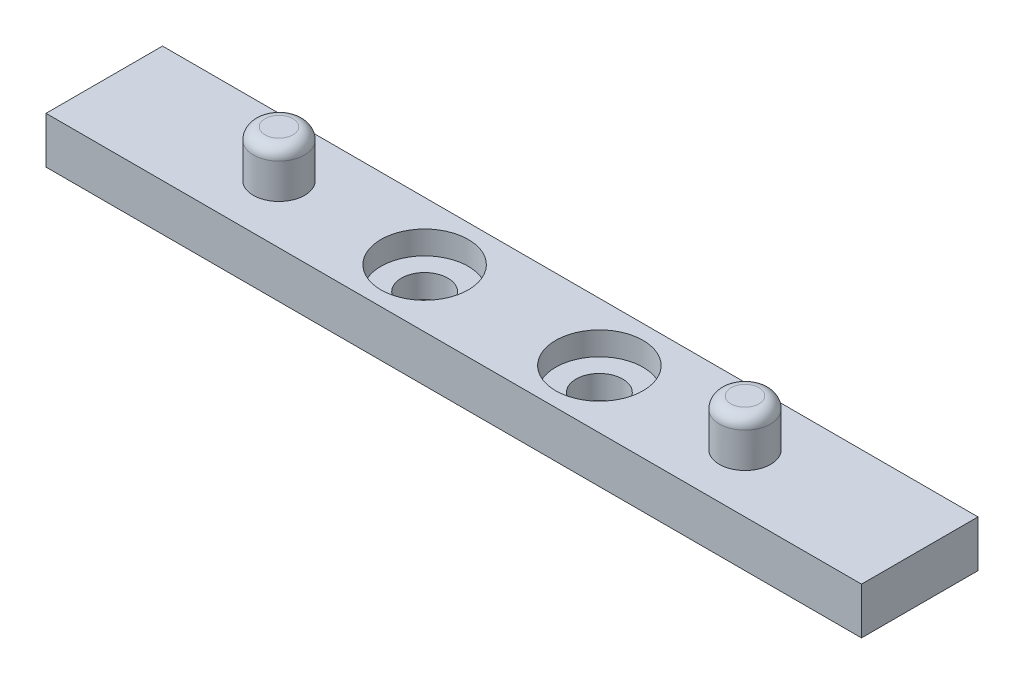
ISO-10303-21;
HEADER;
FILE_DESCRIPTION(('STEP AP214'),'2;1');
FILE_NAME('part.step','',(''),(''),'','','');
FILE_SCHEMA(('AUTOMOTIVE_DESIGN { 1 0 10303 214 1 1 1 1 }'));
ENDSEC;
DATA;
#1=APPLICATION_CONTEXT('core data for automotive mechanical design processes');
#2=APPLICATION_PROTOCOL_DEFINITION('international standard','automotive_design',2000,#1);
#3=PRODUCT_CONTEXT('',#1,'mechanical');
#4=PRODUCT('Part','Part','',(#3));
#5=PRODUCT_RELATED_PRODUCT_CATEGORY('part','',(#4));
#6=PRODUCT_DEFINITION_FORMATION('','',#4);
#7=PRODUCT_DEFINITION_CONTEXT('part definition',#1,'design');
#8=PRODUCT_DEFINITION('design','',#6,#7);
#9=PRODUCT_DEFINITION_SHAPE('','',#8);
#10=(LENGTH_UNIT() NAMED_UNIT(*) SI_UNIT(.MILLI.,.METRE.));
#11=(NAMED_UNIT(*) PLANE_ANGLE_UNIT() SI_UNIT($,.RADIAN.));
#12=(NAMED_UNIT(*) SI_UNIT($,.STERADIAN.) SOLID_ANGLE_UNIT());
#13=UNCERTAINTY_MEASURE_WITH_UNIT(LENGTH_MEASURE(1.E-05),#10,'distance_accuracy_value','');
#14=(GEOMETRIC_REPRESENTATION_CONTEXT(3) GLOBAL_UNCERTAINTY_ASSIGNED_CONTEXT((#13)) GLOBAL_UNIT_ASSIGNED_CONTEXT((#10,
#11,#12)) REPRESENTATION_CONTEXT('',''));
#15=CARTESIAN_POINT('',(0.,0.,0.));
#16=DIRECTION('',(0.,0.,1.));
#17=DIRECTION('',(1.,0.,0.));
#18=AXIS2_PLACEMENT_3D('',#15,#16,#17);
#19=CARTESIAN_POINT('',(34.925,5.08,-6.35));
#20=DIRECTION('',(0.,-1.,0.));
#21=DIRECTION('',(0.,0.,-1.));
#22=AXIS2_PLACEMENT_3D('',#19,#20,#21);
#23=CYLINDRICAL_SURFACE('',#22,2.54);
#24=CARTESIAN_POINT('',(34.925,0.,-6.35));
#25=DIRECTION('',(0.,1.,0.));
#26=DIRECTION('',(0.,0.,1.));
#27=AXIS2_PLACEMENT_3D('',#24,#25,#26);
#28=CIRCLE('',#27,2.54);
#29=CARTESIAN_POINT('',(34.925,0.,-3.81));
#30=VERTEX_POINT('',#29);
#31=EDGE_CURVE('E110',#30,#30,#28,.T.);
#32=ORIENTED_EDGE('',*,*,#31,.F.);
#33=EDGE_LOOP('',(#32));
#34=FACE_BOUND('',#33,.T.);
#35=CARTESIAN_POINT('',(34.925,2.54,-6.35));
#36=DIRECTION('',(0.,1.,0.));
#37=DIRECTION('',(0.,0.,1.));
#38=AXIS2_PLACEMENT_3D('',#35,#36,#37);
#39=CIRCLE('',#38,2.54);
#40=CARTESIAN_POINT('',(34.925,2.54,-3.81));
#41=VERTEX_POINT('',#40);
#42=EDGE_CURVE('E41',#41,#41,#39,.T.);
#43=ORIENTED_EDGE('',*,*,#42,.T.);
#44=EDGE_LOOP('',(#43));
#45=FACE_BOUND('',#44,.T.);
#46=ADVANCED_FACE('F37',(#34,#45),#23,.F.);
#47=CARTESIAN_POINT('',(53.975,5.08,-6.35));
#48=DIRECTION('',(0.,-1.,0.));
#49=DIRECTION('',(0.,0.,-1.));
#50=AXIS2_PLACEMENT_3D('',#47,#48,#49);
#51=CYLINDRICAL_SURFACE('',#50,2.54);
#52=CARTESIAN_POINT('',(53.975,0.,-6.35));
#53=DIRECTION('',(0.,1.,0.));
#54=DIRECTION('',(0.,0.,1.));
#55=AXIS2_PLACEMENT_3D('',#52,#53,#54);
#56=CIRCLE('',#55,2.54);
#57=CARTESIAN_POINT('',(53.975,0.,-3.81));
#58=VERTEX_POINT('',#57);
#59=EDGE_CURVE('E134',#58,#58,#56,.T.);
#60=ORIENTED_EDGE('',*,*,#59,.F.);
#61=EDGE_LOOP('',(#60));
#62=FACE_BOUND('',#61,.T.);
#63=CARTESIAN_POINT('',(53.975,2.54,-6.35));
#64=DIRECTION('',(0.,1.,0.));
#65=DIRECTION('',(0.,0.,1.));
#66=AXIS2_PLACEMENT_3D('',#63,#64,#65);
#67=CIRCLE('',#66,2.54);
#68=CARTESIAN_POINT('',(53.975,2.54,-3.81));
#69=VERTEX_POINT('',#68);
#70=EDGE_CURVE('E128',#69,#69,#67,.T.);
#71=ORIENTED_EDGE('',*,*,#70,.T.);
#72=EDGE_LOOP('',(#71));
#73=FACE_BOUND('',#72,.T.);
#74=ADVANCED_FACE('F161',(#62,#73),#51,.F.);
#75=CARTESIAN_POINT('',(0.,5.08,0.));
#76=DIRECTION('',(0.,-1.,0.));
#77=DIRECTION('',(0.,0.,-1.));
#78=AXIS2_PLACEMENT_3D('',#75,#76,#77);
#79=PLANE('',#78);
#80=CARTESIAN_POINT('',(34.925,5.08,-6.35));
#81=DIRECTION('',(0.,1.,0.));
#82=DIRECTION('',(0.,0.,1.));
#83=AXIS2_PLACEMENT_3D('',#80,#81,#82);
#84=CIRCLE('',#83,4.7625);
#85=CARTESIAN_POINT('',(34.925,5.08,-1.5875));
#86=VERTEX_POINT('',#85);
#87=EDGE_CURVE('E136',#86,#86,#84,.T.);
#88=ORIENTED_EDGE('',*,*,#87,.F.);
#89=EDGE_LOOP('',(#88));
#90=FACE_BOUND('',#89,.T.);
#91=CARTESIAN_POINT('',(53.975,5.08,-6.35));
#92=DIRECTION('',(0.,1.,0.));
#93=DIRECTION('',(0.,0.,1.));
#94=AXIS2_PLACEMENT_3D('',#91,#92,#93);
#95=CIRCLE('',#94,4.7625);
#96=CARTESIAN_POINT('',(53.975,5.08,-1.5875));
#97=VERTEX_POINT('',#96);
#98=EDGE_CURVE('E141',#97,#97,#95,.T.);
#99=ORIENTED_EDGE('',*,*,#98,.F.);
#100=EDGE_LOOP('',(#99));
#101=FACE_BOUND('',#100,.T.);
#102=CARTESIAN_POINT('',(69.85,5.08,-6.35));
#103=DIRECTION('',(0.,-1.,0.));
#104=DIRECTION('',(0.,0.,-1.));
#105=AXIS2_PLACEMENT_3D('',#102,#103,#104);
#106=CIRCLE('',#105,2.794);
#107=CARTESIAN_POINT('',(69.85,5.08,-9.144));
#108=VERTEX_POINT('',#107);
#109=EDGE_CURVE('E118',#108,#108,#106,.F.);
#110=ORIENTED_EDGE('',*,*,#109,.F.);
#111=EDGE_LOOP('',(#110));
#112=FACE_BOUND('',#111,.T.);
#113=CARTESIAN_POINT('',(19.05,5.08,-6.35));
#114=DIRECTION('',(0.,1.,0.));
#115=DIRECTION('',(0.,0.,1.));
#116=AXIS2_PLACEMENT_3D('',#113,#114,#115);
#117=CIRCLE('',#116,2.794);
#118=CARTESIAN_POINT('',(19.05,5.08,-3.556));
#119=VERTEX_POINT('',#118);
#120=EDGE_CURVE('E117',#119,#119,#117,.T.);
#121=ORIENTED_EDGE('',*,*,#120,.F.);
#122=EDGE_LOOP('',(#121));
#123=FACE_BOUND('',#122,.T.);
#124=DIRECTION('',(0.,0.,1.));
#125=VECTOR('',#124,1.);
#126=CARTESIAN_POINT('',(0.,5.08,0.));
#127=LINE('',#126,#125);
#128=CARTESIAN_POINT('',(0.,5.08,-12.7));
#129=VERTEX_POINT('',#128);
#130=CARTESIAN_POINT('',(0.,5.08,0.));
#131=VERTEX_POINT('',#130);
#132=EDGE_CURVE('E92',#129,#131,#127,.T.);
#133=ORIENTED_EDGE('',*,*,#132,.T.);
#134=DIRECTION('',(1.,0.,0.));
#135=VECTOR('',#134,1.);
#136=CARTESIAN_POINT('',(0.,5.08,0.));
#137=LINE('',#136,#135);
#138=CARTESIAN_POINT('',(88.9,5.08,0.));
#139=VERTEX_POINT('',#138);
#140=EDGE_CURVE('E87',#131,#139,#137,.T.);
#141=ORIENTED_EDGE('',*,*,#140,.T.);
#142=DIRECTION('',(0.,0.,-1.));
#143=VECTOR('',#142,1.);
#144=CARTESIAN_POINT('',(88.9,5.08,0.));
#145=LINE('',#144,#143);
#146=CARTESIAN_POINT('',(88.9,5.08,-12.7));
#147=VERTEX_POINT('',#146);
#148=EDGE_CURVE('E90',#139,#147,#145,.T.);
#149=ORIENTED_EDGE('',*,*,#148,.T.);
#150=DIRECTION('',(-1.,0.,0.));
#151=VECTOR('',#150,1.);
#152=CARTESIAN_POINT('',(0.,5.08,-12.7));
#153=LINE('',#152,#151);
#154=EDGE_CURVE('E56',#147,#129,#153,.T.);
#155=ORIENTED_EDGE('',*,*,#154,.T.);
#156=EDGE_LOOP('',(#133,#141,#149,#155));
#157=FACE_BOUND('',#156,.T.);
#158=ADVANCED_FACE('F88',(#90,#101,#112,#123,#157),#79,.F.);
#159=CARTESIAN_POINT('',(0.,0.,0.));
#160=DIRECTION('',(0.,-1.,0.));
#161=DIRECTION('',(0.,0.,-1.));
#162=AXIS2_PLACEMENT_3D('',#159,#160,#161);
#163=PLANE('',#162);
#164=ORIENTED_EDGE('',*,*,#31,.T.);
#165=EDGE_LOOP('',(#164));
#166=FACE_BOUND('',#165,.T.);
#167=DIRECTION('',(0.,0.,1.));
#168=VECTOR('',#167,1.);
#169=CARTESIAN_POINT('',(0.,0.,0.));
#170=LINE('',#169,#168);
#171=CARTESIAN_POINT('',(0.,0.,-12.7));
#172=VERTEX_POINT('',#171);
#173=CARTESIAN_POINT('',(0.,0.,0.));
#174=VERTEX_POINT('',#173);
#175=EDGE_CURVE('E107',#172,#174,#170,.T.);
#176=ORIENTED_EDGE('',*,*,#175,.F.);
#177=DIRECTION('',(-1.,0.,0.));
#178=VECTOR('',#177,1.);
#179=CARTESIAN_POINT('',(0.,0.,-12.7));
#180=LINE('',#179,#178);
#181=CARTESIAN_POINT('',(88.9,0.,-12.7));
#182=VERTEX_POINT('',#181);
#183=EDGE_CURVE('E79',#182,#172,#180,.T.);
#184=ORIENTED_EDGE('',*,*,#183,.F.);
#185=DIRECTION('',(0.,0.,-1.));
#186=VECTOR('',#185,1.);
#187=CARTESIAN_POINT('',(88.9,0.,0.));
#188=LINE('',#187,#186);
#189=CARTESIAN_POINT('',(88.9,0.,0.));
#190=VERTEX_POINT('',#189);
#191=EDGE_CURVE('E73',#190,#182,#188,.T.);
#192=ORIENTED_EDGE('',*,*,#191,.F.);
#193=DIRECTION('',(1.,0.,0.));
#194=VECTOR('',#193,1.);
#195=CARTESIAN_POINT('',(0.,0.,0.));
#196=LINE('',#195,#194);
#197=EDGE_CURVE('E97',#174,#190,#196,.T.);
#198=ORIENTED_EDGE('',*,*,#197,.F.);
#199=EDGE_LOOP('',(#176,#184,#192,#198));
#200=FACE_BOUND('',#199,.T.);
#201=ORIENTED_EDGE('',*,*,#59,.T.);
#202=EDGE_LOOP('',(#201));
#203=FACE_BOUND('',#202,.T.);
#204=ADVANCED_FACE('F156',(#166,#200,#203),#163,.T.);
#205=CARTESIAN_POINT('',(0.,5.08,0.));
#206=DIRECTION('',(1.,0.,0.));
#207=DIRECTION('',(0.,0.,-1.));
#208=AXIS2_PLACEMENT_3D('',#205,#206,#207);
#209=PLANE('',#208);
#210=ORIENTED_EDGE('',*,*,#175,.T.);
#211=DIRECTION('',(0.,-1.,0.));
#212=VECTOR('',#211,1.);
#213=CARTESIAN_POINT('',(0.,5.08,0.));
#214=LINE('',#213,#212);
#215=EDGE_CURVE('E98',#131,#174,#214,.T.);
#216=ORIENTED_EDGE('',*,*,#215,.F.);
#217=ORIENTED_EDGE('',*,*,#132,.F.);
#218=DIRECTION('',(0.,-1.,0.));
#219=VECTOR('',#218,1.);
#220=CARTESIAN_POINT('',(0.,5.08,-12.7));
#221=LINE('',#220,#219);
#222=EDGE_CURVE('E103',#129,#172,#221,.T.);
#223=ORIENTED_EDGE('',*,*,#222,.T.);
#224=EDGE_LOOP('',(#210,#216,#217,#223));
#225=FACE_BOUND('',#224,.T.);
#226=ADVANCED_FACE('F209',(#225),#209,.F.);
#227=CARTESIAN_POINT('',(0.,5.08,0.));
#228=DIRECTION('',(0.,0.,-1.));
#229=DIRECTION('',(-1.,0.,0.));
#230=AXIS2_PLACEMENT_3D('',#227,#228,#229);
#231=PLANE('',#230);
#232=ORIENTED_EDGE('',*,*,#197,.T.);
#233=DIRECTION('',(0.,-1.,0.));
#234=VECTOR('',#233,1.);
#235=CARTESIAN_POINT('',(88.9,5.08,0.));
#236=LINE('',#235,#234);
#237=EDGE_CURVE('E95',#139,#190,#236,.T.);
#238=ORIENTED_EDGE('',*,*,#237,.F.);
#239=ORIENTED_EDGE('',*,*,#140,.F.);
#240=ORIENTED_EDGE('',*,*,#215,.T.);
#241=EDGE_LOOP('',(#232,#238,#239,#240));
#242=FACE_BOUND('',#241,.T.);
#243=ADVANCED_FACE('F96',(#242),#231,.F.);
#244=CARTESIAN_POINT('',(88.9,5.08,0.));
#245=DIRECTION('',(-1.,0.,0.));
#246=DIRECTION('',(0.,0.,1.));
#247=AXIS2_PLACEMENT_3D('',#244,#245,#246);
#248=PLANE('',#247);
#249=ORIENTED_EDGE('',*,*,#191,.T.);
#250=DIRECTION('',(0.,-1.,0.));
#251=VECTOR('',#250,1.);
#252=CARTESIAN_POINT('',(88.9,5.08,-12.7));
#253=LINE('',#252,#251);
#254=EDGE_CURVE('E99',#147,#182,#253,.T.);
#255=ORIENTED_EDGE('',*,*,#254,.F.);
#256=ORIENTED_EDGE('',*,*,#148,.F.);
#257=ORIENTED_EDGE('',*,*,#237,.T.);
#258=EDGE_LOOP('',(#249,#255,#256,#257));
#259=FACE_BOUND('',#258,.T.);
#260=ADVANCED_FACE('F101',(#259),#248,.F.);
#261=CARTESIAN_POINT('',(0.,5.08,-12.7));
#262=DIRECTION('',(0.,0.,1.));
#263=DIRECTION('',(1.,0.,0.));
#264=AXIS2_PLACEMENT_3D('',#261,#262,#263);
#265=PLANE('',#264);
#266=ORIENTED_EDGE('',*,*,#183,.T.);
#267=ORIENTED_EDGE('',*,*,#222,.F.);
#268=ORIENTED_EDGE('',*,*,#154,.F.);
#269=ORIENTED_EDGE('',*,*,#254,.T.);
#270=EDGE_LOOP('',(#266,#267,#268,#269));
#271=FACE_BOUND('',#270,.T.);
#272=ADVANCED_FACE('F199',(#271),#265,.F.);
#273=CARTESIAN_POINT('',(19.05,10.16,-6.35));
#274=DIRECTION('',(0.,-1.,0.));
#275=DIRECTION('',(0.,0.,-1.));
#276=AXIS2_PLACEMENT_3D('',#273,#274,#275);
#277=CYLINDRICAL_SURFACE('',#276,2.794);
#278=CARTESIAN_POINT('',(19.05,8.89,-6.35));
#279=DIRECTION('',(0.,1.,0.));
#280=DIRECTION('',(0.,0.,1.));
#281=AXIS2_PLACEMENT_3D('',#278,#279,#280);
#282=CIRCLE('',#281,2.794);
#283=CARTESIAN_POINT('',(19.05,8.89,-3.556));
#284=VERTEX_POINT('',#283);
#285=EDGE_CURVE('E11',#284,#284,#282,.F.);
#286=ORIENTED_EDGE('',*,*,#285,.T.);
#287=EDGE_LOOP('',(#286));
#288=FACE_BOUND('',#287,.T.);
#289=ORIENTED_EDGE('',*,*,#120,.T.);
#290=EDGE_LOOP('',(#289));
#291=FACE_BOUND('',#290,.T.);
#292=ADVANCED_FACE('F195',(#288,#291),#277,.T.);
#293=CARTESIAN_POINT('',(19.05,10.16,-6.35));
#294=DIRECTION('',(0.,1.,0.));
#295=DIRECTION('',(0.,0.,1.));
#296=AXIS2_PLACEMENT_3D('',#293,#294,#295);
#297=PLANE('',#296);
#298=CARTESIAN_POINT('',(19.05,10.16,-6.35));
#299=DIRECTION('',(0.,1.,0.));
#300=DIRECTION('',(0.,0.,1.));
#301=AXIS2_PLACEMENT_3D('',#298,#299,#300);
#302=CIRCLE('',#301,1.524);
#303=CARTESIAN_POINT('',(19.05,10.16,-4.826));
#304=VERTEX_POINT('',#303);
#305=EDGE_CURVE('E47',#304,#304,#302,.T.);
#306=ORIENTED_EDGE('',*,*,#305,.T.);
#307=EDGE_LOOP('',(#306));
#308=FACE_BOUND('',#307,.T.);
#309=ADVANCED_FACE('F187',(#308),#297,.T.);
#310=CARTESIAN_POINT('',(69.85,10.16,-6.35));
#311=DIRECTION('',(0.,-1.,0.));
#312=DIRECTION('',(0.,0.,-1.));
#313=AXIS2_PLACEMENT_3D('',#310,#311,#312);
#314=CYLINDRICAL_SURFACE('',#313,2.794);
#315=CARTESIAN_POINT('',(69.85,8.89,-6.35));
#316=DIRECTION('',(0.,1.,0.));
#317=DIRECTION('',(0.,0.,1.));
#318=AXIS2_PLACEMENT_3D('',#315,#316,#317);
#319=CIRCLE('',#318,2.794);
#320=CARTESIAN_POINT('',(69.85,8.89,-3.556));
#321=VERTEX_POINT('',#320);
#322=EDGE_CURVE('E124',#321,#321,#319,.F.);
#323=ORIENTED_EDGE('',*,*,#322,.T.);
#324=EDGE_LOOP('',(#323));
#325=FACE_BOUND('',#324,.T.);
#326=ORIENTED_EDGE('',*,*,#109,.T.);
#327=EDGE_LOOP('',(#326));
#328=FACE_BOUND('',#327,.T.);
#329=ADVANCED_FACE('F183',(#325,#328),#314,.T.);
#330=CARTESIAN_POINT('',(69.85,10.16,-6.35));
#331=DIRECTION('',(0.,1.,0.));
#332=DIRECTION('',(0.,0.,1.));
#333=AXIS2_PLACEMENT_3D('',#330,#331,#332);
#334=PLANE('',#333);
#335=CARTESIAN_POINT('',(69.85,10.16,-6.35));
#336=DIRECTION('',(0.,1.,0.));
#337=DIRECTION('',(0.,0.,1.));
#338=AXIS2_PLACEMENT_3D('',#335,#336,#337);
#339=CIRCLE('',#338,1.524);
#340=CARTESIAN_POINT('',(69.85,10.16,-4.826));
#341=VERTEX_POINT('',#340);
#342=EDGE_CURVE('E121',#341,#341,#339,.T.);
#343=ORIENTED_EDGE('',*,*,#342,.T.);
#344=EDGE_LOOP('',(#343));
#345=FACE_BOUND('',#344,.T.);
#346=ADVANCED_FACE('F186',(#345),#334,.T.);
#347=CARTESIAN_POINT('',(69.85,8.89,-6.35));
#348=DIRECTION('',(0.,1.,0.));
#349=DIRECTION('',(0.,0.,1.));
#350=AXIS2_PLACEMENT_3D('',#347,#348,#349);
#351=TOROIDAL_SURFACE('',#350,1.524,1.27);
#352=ORIENTED_EDGE('',*,*,#322,.F.);
#353=EDGE_LOOP('',(#352));
#354=FACE_BOUND('',#353,.T.);
#355=ORIENTED_EDGE('',*,*,#342,.F.);
#356=EDGE_LOOP('',(#355));
#357=FACE_BOUND('',#356,.T.);
#358=ADVANCED_FACE('F191',(#354,#357),#351,.T.);
#359=CARTESIAN_POINT('',(19.05,8.89,-6.35));
#360=DIRECTION('',(0.,1.,0.));
#361=DIRECTION('',(0.,0.,1.));
#362=AXIS2_PLACEMENT_3D('',#359,#360,#361);
#363=TOROIDAL_SURFACE('',#362,1.524,1.27);
#364=ORIENTED_EDGE('',*,*,#285,.F.);
#365=EDGE_LOOP('',(#364));
#366=FACE_BOUND('',#365,.T.);
#367=ORIENTED_EDGE('',*,*,#305,.F.);
#368=EDGE_LOOP('',(#367));
#369=FACE_BOUND('',#368,.T.);
#370=ADVANCED_FACE('F39',(#366,#369),#363,.T.);
#371=CARTESIAN_POINT('',(53.975,2.54,-6.35));
#372=DIRECTION('',(0.,1.,0.));
#373=DIRECTION('',(0.,0.,1.));
#374=AXIS2_PLACEMENT_3D('',#371,#372,#373);
#375=CYLINDRICAL_SURFACE('',#374,4.7625);
#376=CARTESIAN_POINT('',(53.975,2.54,-6.35));
#377=DIRECTION('',(0.,1.,0.));
#378=DIRECTION('',(0.,0.,1.));
#379=AXIS2_PLACEMENT_3D('',#376,#377,#378);
#380=CIRCLE('',#379,4.7625);
#381=CARTESIAN_POINT('',(53.975,2.54,-1.5875));
#382=VERTEX_POINT('',#381);
#383=EDGE_CURVE('E146',#382,#382,#380,.T.);
#384=ORIENTED_EDGE('',*,*,#383,.F.);
#385=EDGE_LOOP('',(#384));
#386=FACE_BOUND('',#385,.T.);
#387=ORIENTED_EDGE('',*,*,#98,.T.);
#388=EDGE_LOOP('',(#387));
#389=FACE_BOUND('',#388,.T.);
#390=ADVANCED_FACE('F176',(#386,#389),#375,.F.);
#391=CARTESIAN_POINT('',(53.975,2.54,-6.35));
#392=DIRECTION('',(0.,1.,0.));
#393=DIRECTION('',(0.,0.,1.));
#394=AXIS2_PLACEMENT_3D('',#391,#392,#393);
#395=PLANE('',#394);
#396=ORIENTED_EDGE('',*,*,#70,.F.);
#397=EDGE_LOOP('',(#396));
#398=FACE_BOUND('',#397,.T.);
#399=ORIENTED_EDGE('',*,*,#383,.T.);
#400=EDGE_LOOP('',(#399));
#401=FACE_BOUND('',#400,.T.);
#402=ADVANCED_FACE('F172',(#398,#401),#395,.T.);
#403=CARTESIAN_POINT('',(34.925,2.54,-6.35));
#404=DIRECTION('',(0.,1.,0.));
#405=DIRECTION('',(0.,0.,1.));
#406=AXIS2_PLACEMENT_3D('',#403,#404,#405);
#407=CYLINDRICAL_SURFACE('',#406,4.7625);
#408=CARTESIAN_POINT('',(34.925,2.54,-6.35));
#409=DIRECTION('',(0.,1.,0.));
#410=DIRECTION('',(0.,0.,1.));
#411=AXIS2_PLACEMENT_3D('',#408,#409,#410);
#412=CIRCLE('',#411,4.7625);
#413=CARTESIAN_POINT('',(34.925,2.54,-1.5875));
#414=VERTEX_POINT('',#413);
#415=EDGE_CURVE('E130',#414,#414,#412,.T.);
#416=ORIENTED_EDGE('',*,*,#415,.F.);
#417=EDGE_LOOP('',(#416));
#418=FACE_BOUND('',#417,.T.);
#419=ORIENTED_EDGE('',*,*,#87,.T.);
#420=EDGE_LOOP('',(#419));
#421=FACE_BOUND('',#420,.T.);
#422=ADVANCED_FACE('F167',(#418,#421),#407,.F.);
#423=CARTESIAN_POINT('',(34.925,2.54,-6.35));
#424=DIRECTION('',(0.,1.,0.));
#425=DIRECTION('',(0.,0.,1.));
#426=AXIS2_PLACEMENT_3D('',#423,#424,#425);
#427=PLANE('',#426);
#428=ORIENTED_EDGE('',*,*,#42,.F.);
#429=EDGE_LOOP('',(#428));
#430=FACE_BOUND('',#429,.T.);
#431=ORIENTED_EDGE('',*,*,#415,.T.);
#432=EDGE_LOOP('',(#431));
#433=FACE_BOUND('',#432,.T.);
#434=ADVANCED_FACE('F165',(#430,#433),#427,.T.);
#435=CLOSED_SHELL('',(#46,#74,#158,#204,#226,#243,#260,#272,#292,#309,#329,#346,#358,#370,#390,
#402,#422,#434));
#436=MANIFOLD_SOLID_BREP('B2',#435);
#437=ADVANCED_BREP_SHAPE_REPRESENTATION('',(#18,#436),#14);
#438=SHAPE_DEFINITION_REPRESENTATION(#9,#437);
ENDSEC;
END-ISO-10303-21;
